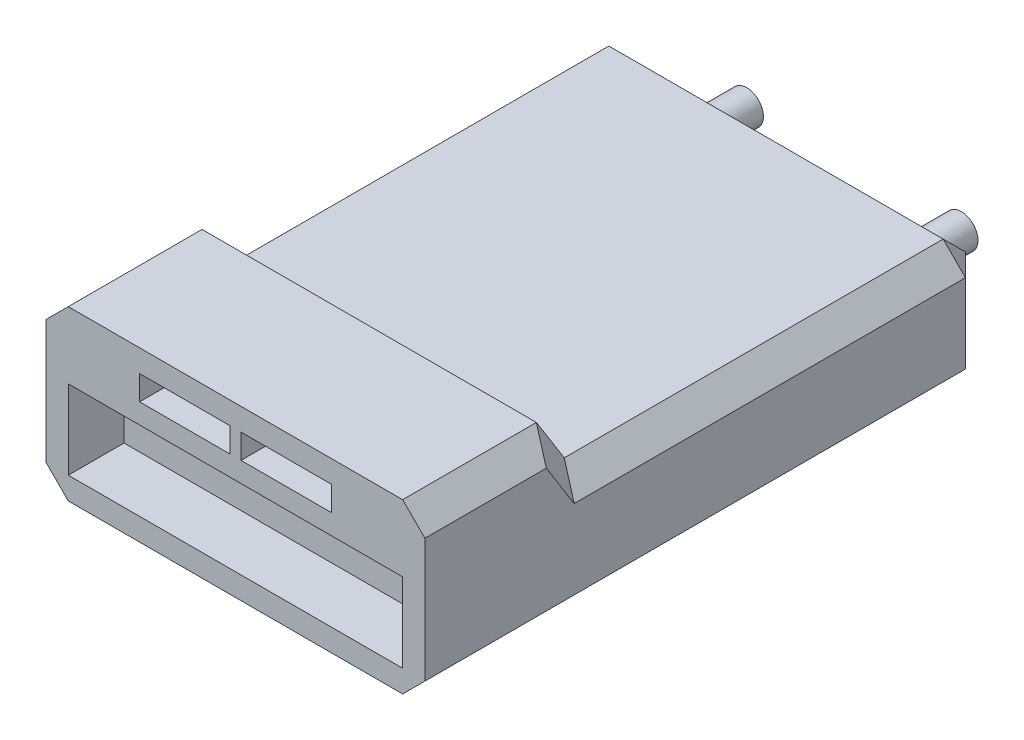
ISO-10303-21;
HEADER;
FILE_DESCRIPTION(('STEP AP214'),'2;1');
FILE_NAME('part.step','',(''),(''),'','','');
FILE_SCHEMA(('AUTOMOTIVE_DESIGN { 1 0 10303 214 1 1 1 1 }'));
ENDSEC;
DATA;
#1=APPLICATION_CONTEXT('core data for automotive mechanical design processes');
#2=APPLICATION_PROTOCOL_DEFINITION('international standard','automotive_design',2000,#1);
#3=PRODUCT_CONTEXT('',#1,'mechanical');
#4=PRODUCT('Part','Part','',(#3));
#5=PRODUCT_RELATED_PRODUCT_CATEGORY('part','',(#4));
#6=PRODUCT_DEFINITION_FORMATION('','',#4);
#7=PRODUCT_DEFINITION_CONTEXT('part definition',#1,'design');
#8=PRODUCT_DEFINITION('design','',#6,#7);
#9=PRODUCT_DEFINITION_SHAPE('','',#8);
#10=(LENGTH_UNIT() NAMED_UNIT(*) SI_UNIT(.MILLI.,.METRE.));
#11=(NAMED_UNIT(*) PLANE_ANGLE_UNIT() SI_UNIT($,.RADIAN.));
#12=(NAMED_UNIT(*) SI_UNIT($,.STERADIAN.) SOLID_ANGLE_UNIT());
#13=UNCERTAINTY_MEASURE_WITH_UNIT(LENGTH_MEASURE(1.E-05),#10,'distance_accuracy_value','');
#14=(GEOMETRIC_REPRESENTATION_CONTEXT(3) GLOBAL_UNCERTAINTY_ASSIGNED_CONTEXT((#13)) GLOBAL_UNIT_ASSIGNED_CONTEXT((#10,
#11,#12)) REPRESENTATION_CONTEXT('',''));
#15=CARTESIAN_POINT('',(0.,0.,0.));
#16=DIRECTION('',(0.,0.,1.));
#17=DIRECTION('',(1.,0.,0.));
#18=AXIS2_PLACEMENT_3D('',#15,#16,#17);
#19=CARTESIAN_POINT('',(17.,15.1,0.));
#20=DIRECTION('',(0.,0.,-1.));
#21=DIRECTION('',(0.,1.,0.));
#22=AXIS2_PLACEMENT_3D('',#19,#20,#21);
#23=PLANE('',#22);
#24=DIRECTION('',(1.,0.,0.));
#25=VECTOR('',#24,1.);
#26=CARTESIAN_POINT('',(-15.,2.,0.));
#27=LINE('',#26,#25);
#28=CARTESIAN_POINT('',(-15.,2.,0.));
#29=VERTEX_POINT('',#28);
#30=CARTESIAN_POINT('',(15.,2.,0.));
#31=VERTEX_POINT('',#30);
#32=EDGE_CURVE('E238',#29,#31,#27,.T.);
#33=ORIENTED_EDGE('',*,*,#32,.F.);
#34=DIRECTION('',(0.,-1.,0.));
#35=VECTOR('',#34,1.);
#36=CARTESIAN_POINT('',(-15.,9.1,0.));
#37=LINE('',#36,#35);
#38=CARTESIAN_POINT('',(-15.,9.1,0.));
#39=VERTEX_POINT('',#38);
#40=EDGE_CURVE('E212',#39,#29,#37,.T.);
#41=ORIENTED_EDGE('',*,*,#40,.F.);
#42=DIRECTION('',(-1.,0.,0.));
#43=VECTOR('',#42,1.);
#44=CARTESIAN_POINT('',(-15.,9.1,0.));
#45=LINE('',#44,#43);
#46=CARTESIAN_POINT('',(15.,9.1,0.));
#47=VERTEX_POINT('',#46);
#48=EDGE_CURVE('E229',#47,#39,#45,.T.);
#49=ORIENTED_EDGE('',*,*,#48,.F.);
#50=DIRECTION('',(0.,1.,0.));
#51=VECTOR('',#50,1.);
#52=CARTESIAN_POINT('',(15.,9.1,0.));
#53=LINE('',#52,#51);
#54=EDGE_CURVE('E232',#31,#47,#53,.T.);
#55=ORIENTED_EDGE('',*,*,#54,.F.);
#56=EDGE_LOOP('',(#33,#41,#49,#55));
#57=FACE_BOUND('',#56,.T.);
#58=DIRECTION('',(1.,0.,0.));
#59=VECTOR('',#58,1.);
#60=CARTESIAN_POINT('',(-8.6,10.9,0.));
#61=LINE('',#60,#59);
#62=CARTESIAN_POINT('',(-8.6,10.9,0.));
#63=VERTEX_POINT('',#62);
#64=CARTESIAN_POINT('',(-0.5,10.9,0.));
#65=VERTEX_POINT('',#64);
#66=EDGE_CURVE('E265',#63,#65,#61,.T.);
#67=ORIENTED_EDGE('',*,*,#66,.F.);
#68=DIRECTION('',(0.,-1.,0.));
#69=VECTOR('',#68,1.);
#70=CARTESIAN_POINT('',(-8.6,13.1,0.));
#71=LINE('',#70,#69);
#72=CARTESIAN_POINT('',(-8.6,13.1,0.));
#73=VERTEX_POINT('',#72);
#74=EDGE_CURVE('E263',#73,#63,#71,.T.);
#75=ORIENTED_EDGE('',*,*,#74,.F.);
#76=DIRECTION('',(-1.,0.,0.));
#77=VECTOR('',#76,1.);
#78=CARTESIAN_POINT('',(-8.6,13.1,0.));
#79=LINE('',#78,#77);
#80=CARTESIAN_POINT('',(-0.5,13.1,0.));
#81=VERTEX_POINT('',#80);
#82=EDGE_CURVE('E253',#81,#73,#79,.T.);
#83=ORIENTED_EDGE('',*,*,#82,.F.);
#84=DIRECTION('',(0.,1.,0.));
#85=VECTOR('',#84,1.);
#86=CARTESIAN_POINT('',(-0.5,13.1,0.));
#87=LINE('',#86,#85);
#88=EDGE_CURVE('E269',#65,#81,#87,.T.);
#89=ORIENTED_EDGE('',*,*,#88,.F.);
#90=EDGE_LOOP('',(#67,#75,#83,#89));
#91=FACE_BOUND('',#90,.T.);
#92=DIRECTION('',(1.,0.,0.));
#93=VECTOR('',#92,1.);
#94=CARTESIAN_POINT('',(0.499999999999999,10.9,0.));
#95=LINE('',#94,#93);
#96=CARTESIAN_POINT('',(0.5,10.9,0.));
#97=VERTEX_POINT('',#96);
#98=CARTESIAN_POINT('',(8.6,10.9,0.));
#99=VERTEX_POINT('',#98);
#100=EDGE_CURVE('E297',#97,#99,#95,.T.);
#101=ORIENTED_EDGE('',*,*,#100,.F.);
#102=DIRECTION('',(0.,-1.,0.));
#103=VECTOR('',#102,1.);
#104=CARTESIAN_POINT('',(0.499999999999999,13.1,0.));
#105=LINE('',#104,#103);
#106=CARTESIAN_POINT('',(0.499999999999999,13.1,0.));
#107=VERTEX_POINT('',#106);
#108=EDGE_CURVE('E295',#107,#97,#105,.T.);
#109=ORIENTED_EDGE('',*,*,#108,.F.);
#110=DIRECTION('',(-1.,0.,0.));
#111=VECTOR('',#110,1.);
#112=CARTESIAN_POINT('',(0.499999999999999,13.1,0.));
#113=LINE('',#112,#111);
#114=CARTESIAN_POINT('',(8.6,13.1,0.));
#115=VERTEX_POINT('',#114);
#116=EDGE_CURVE('E285',#115,#107,#113,.T.);
#117=ORIENTED_EDGE('',*,*,#116,.F.);
#118=DIRECTION('',(0.,1.,0.));
#119=VECTOR('',#118,1.);
#120=CARTESIAN_POINT('',(8.6,13.1,0.));
#121=LINE('',#120,#119);
#122=EDGE_CURVE('E300',#99,#115,#121,.T.);
#123=ORIENTED_EDGE('',*,*,#122,.F.);
#124=EDGE_LOOP('',(#101,#109,#117,#123));
#125=FACE_BOUND('',#124,.T.);
#126=DIRECTION('',(0.,-1.,0.));
#127=VECTOR('',#126,1.);
#128=CARTESIAN_POINT('',(-17.,15.1,0.));
#129=LINE('',#128,#127);
#130=CARTESIAN_POINT('',(-17.,13.1,0.));
#131=VERTEX_POINT('',#130);
#132=CARTESIAN_POINT('',(-17.,1.99999999999999,0.));
#133=VERTEX_POINT('',#132);
#134=EDGE_CURVE('E317',#131,#133,#129,.T.);
#135=ORIENTED_EDGE('',*,*,#134,.T.);
#136=DIRECTION('',(-0.707106781186546,0.707106781186549,0.));
#137=VECTOR('',#136,1.);
#138=CARTESIAN_POINT('',(-15.,0.,0.));
#139=LINE('',#138,#137);
#140=CARTESIAN_POINT('',(-15.,0.,0.));
#141=VERTEX_POINT('',#140);
#142=EDGE_CURVE('E373',#133,#141,#139,.F.);
#143=ORIENTED_EDGE('',*,*,#142,.T.);
#144=DIRECTION('',(-1.,0.,0.));
#145=VECTOR('',#144,1.);
#146=CARTESIAN_POINT('',(17.,0.,0.));
#147=LINE('',#146,#145);
#148=CARTESIAN_POINT('',(15.,0.,0.));
#149=VERTEX_POINT('',#148);
#150=EDGE_CURVE('E332',#149,#141,#147,.T.);
#151=ORIENTED_EDGE('',*,*,#150,.F.);
#152=DIRECTION('',(0.707106781186549,0.707106781186546,0.));
#153=VECTOR('',#152,1.);
#154=CARTESIAN_POINT('',(17.,1.99999999999999,0.));
#155=LINE('',#154,#153);
#156=CARTESIAN_POINT('',(17.,1.99999999999999,0.));
#157=VERTEX_POINT('',#156);
#158=EDGE_CURVE('E371',#149,#157,#155,.T.);
#159=ORIENTED_EDGE('',*,*,#158,.T.);
#160=DIRECTION('',(0.,-1.,0.));
#161=VECTOR('',#160,1.);
#162=CARTESIAN_POINT('',(17.,15.1,0.));
#163=LINE('',#162,#161);
#164=CARTESIAN_POINT('',(17.,13.1,0.));
#165=VERTEX_POINT('',#164);
#166=EDGE_CURVE('E318',#165,#157,#163,.T.);
#167=ORIENTED_EDGE('',*,*,#166,.F.);
#168=DIRECTION('',(-0.707106781186549,0.707106781186547,0.));
#169=VECTOR('',#168,1.);
#170=CARTESIAN_POINT('',(17.,13.1,0.));
#171=LINE('',#170,#169);
#172=CARTESIAN_POINT('',(15.,15.1,0.));
#173=VERTEX_POINT('',#172);
#174=EDGE_CURVE('E367',#165,#173,#171,.T.);
#175=ORIENTED_EDGE('',*,*,#174,.T.);
#176=DIRECTION('',(-1.,0.,0.));
#177=VECTOR('',#176,1.);
#178=CARTESIAN_POINT('',(17.,15.1,0.));
#179=LINE('',#178,#177);
#180=CARTESIAN_POINT('',(-15.,15.1,0.));
#181=VERTEX_POINT('',#180);
#182=EDGE_CURVE('E321',#173,#181,#179,.T.);
#183=ORIENTED_EDGE('',*,*,#182,.T.);
#184=DIRECTION('',(0.707106781186546,0.707106781186549,0.));
#185=VECTOR('',#184,1.);
#186=CARTESIAN_POINT('',(-15.,15.1,0.));
#187=LINE('',#186,#185);
#188=EDGE_CURVE('E369',#181,#131,#187,.F.);
#189=ORIENTED_EDGE('',*,*,#188,.T.);
#190=EDGE_LOOP('',(#135,#143,#151,#159,#167,#175,#183,#189));
#191=FACE_BOUND('',#190,.T.);
#192=ADVANCED_FACE('F32',(#57,#91,#125,#191),#23,.F.);
#193=CARTESIAN_POINT('',(17.,0.,0.));
#194=DIRECTION('',(0.,1.,0.));
#195=DIRECTION('',(0.,0.,1.));
#196=AXIS2_PLACEMENT_3D('',#193,#194,#195);
#197=PLANE('',#196);
#198=ORIENTED_EDGE('',*,*,#150,.T.);
#199=DIRECTION('',(0.,0.,-1.));
#200=VECTOR('',#199,1.);
#201=CARTESIAN_POINT('',(-15.,0.,0.));
#202=LINE('',#201,#200);
#203=CARTESIAN_POINT('',(-15.,0.,-48.5));
#204=VERTEX_POINT('',#203);
#205=EDGE_CURVE('E365',#141,#204,#202,.T.);
#206=ORIENTED_EDGE('',*,*,#205,.T.);
#207=DIRECTION('',(1.,0.,0.));
#208=VECTOR('',#207,1.);
#209=CARTESIAN_POINT('',(17.,0.,-48.5));
#210=LINE('',#209,#208);
#211=CARTESIAN_POINT('',(15.,0.,-48.5));
#212=VERTEX_POINT('',#211);
#213=EDGE_CURVE('E363',#204,#212,#210,.T.);
#214=ORIENTED_EDGE('',*,*,#213,.T.);
#215=DIRECTION('',(0.,0.,1.));
#216=VECTOR('',#215,1.);
#217=CARTESIAN_POINT('',(15.,0.,0.));
#218=LINE('',#217,#216);
#219=EDGE_CURVE('E361',#212,#149,#218,.T.);
#220=ORIENTED_EDGE('',*,*,#219,.T.);
#221=EDGE_LOOP('',(#198,#206,#214,#220));
#222=FACE_BOUND('',#221,.T.);
#223=ADVANCED_FACE('F484',(#222),#197,.F.);
#224=CARTESIAN_POINT('',(17.,0.,-50.5));
#225=DIRECTION('',(0.,0.,1.));
#226=DIRECTION('',(1.,0.,0.));
#227=AXIS2_PLACEMENT_3D('',#224,#225,#226);
#228=PLANE('',#227);
#229=DIRECTION('',(-1.,0.,0.));
#230=VECTOR('',#229,1.);
#231=CARTESIAN_POINT('',(17.,1.99999999999999,-50.5));
#232=LINE('',#231,#230);
#233=CARTESIAN_POINT('',(15.,1.99999999999999,-50.5));
#234=VERTEX_POINT('',#233);
#235=CARTESIAN_POINT('',(-15.,1.99999999999999,-50.5));
#236=VERTEX_POINT('',#235);
#237=EDGE_CURVE('E345',#234,#236,#232,.T.);
#238=ORIENTED_EDGE('',*,*,#237,.T.);
#239=DIRECTION('',(0.,1.,0.));
#240=VECTOR('',#239,1.);
#241=CARTESIAN_POINT('',(-15.,0.,-50.5));
#242=LINE('',#241,#240);
#243=CARTESIAN_POINT('',(-15.,9.10000000000001,-50.5));
#244=VERTEX_POINT('',#243);
#245=EDGE_CURVE('E347',#236,#244,#242,.T.);
#246=ORIENTED_EDGE('',*,*,#245,.T.);
#247=DIRECTION('',(1.,0.,0.));
#248=VECTOR('',#247,1.);
#249=CARTESIAN_POINT('',(17.,9.10000000000001,-50.5));
#250=LINE('',#249,#248);
#251=CARTESIAN_POINT('',(15.,9.10000000000001,-50.5));
#252=VERTEX_POINT('',#251);
#253=EDGE_CURVE('E341',#244,#252,#250,.T.);
#254=ORIENTED_EDGE('',*,*,#253,.T.);
#255=DIRECTION('',(0.,-1.,0.));
#256=VECTOR('',#255,1.);
#257=CARTESIAN_POINT('',(15.,0.,-50.5));
#258=LINE('',#257,#256);
#259=EDGE_CURVE('E343',#252,#234,#258,.T.);
#260=ORIENTED_EDGE('',*,*,#259,.T.);
#261=EDGE_LOOP('',(#238,#246,#254,#260));
#262=FACE_BOUND('',#261,.T.);
#263=CARTESIAN_POINT('',(9.625,5.55,-50.5));
#264=DIRECTION('',(0.,0.,1.));
#265=DIRECTION('',(1.,0.,0.));
#266=AXIS2_PLACEMENT_3D('',#263,#264,#265);
#267=CIRCLE('',#266,1.5);
#268=CARTESIAN_POINT('',(11.125,5.55,-50.5));
#269=VERTEX_POINT('',#268);
#270=EDGE_CURVE('E338',#269,#269,#267,.F.);
#271=ORIENTED_EDGE('',*,*,#270,.F.);
#272=EDGE_LOOP('',(#271));
#273=FACE_BOUND('',#272,.T.);
#274=CARTESIAN_POINT('',(-9.625,5.55,-50.5));
#275=DIRECTION('',(0.,0.,1.));
#276=DIRECTION('',(1.,0.,0.));
#277=AXIS2_PLACEMENT_3D('',#274,#275,#276);
#278=CIRCLE('',#277,1.5);
#279=CARTESIAN_POINT('',(-8.125,5.55,-50.5));
#280=VERTEX_POINT('',#279);
#281=EDGE_CURVE('E335',#280,#280,#278,.F.);
#282=ORIENTED_EDGE('',*,*,#281,.F.);
#283=EDGE_LOOP('',(#282));
#284=FACE_BOUND('',#283,.T.);
#285=ADVANCED_FACE('F490',(#262,#273,#284),#228,.F.);
#286=CARTESIAN_POINT('',(17.,11.1,-50.5));
#287=DIRECTION('',(0.,-1.,0.));
#288=DIRECTION('',(0.,0.,-1.));
#289=AXIS2_PLACEMENT_3D('',#286,#287,#288);
#290=PLANE('',#289);
#291=DIRECTION('',(-1.,0.,0.));
#292=VECTOR('',#291,1.);
#293=CARTESIAN_POINT('',(17.,11.1,-48.5));
#294=LINE('',#293,#292);
#295=CARTESIAN_POINT('',(15.,11.1,-48.5));
#296=VERTEX_POINT('',#295);
#297=CARTESIAN_POINT('',(-15.,11.1,-48.5));
#298=VERTEX_POINT('',#297);
#299=EDGE_CURVE('E41',#296,#298,#294,.T.);
#300=ORIENTED_EDGE('',*,*,#299,.T.);
#301=DIRECTION('',(0.,0.,1.));
#302=VECTOR('',#301,1.);
#303=CARTESIAN_POINT('',(-15.,11.1,-50.5));
#304=LINE('',#303,#302);
#305=CARTESIAN_POINT('',(-15.,11.1,-14.5));
#306=VERTEX_POINT('',#305);
#307=EDGE_CURVE('E11',#298,#306,#304,.T.);
#308=ORIENTED_EDGE('',*,*,#307,.T.);
#309=DIRECTION('',(-1.,0.,0.));
#310=VECTOR('',#309,1.);
#311=CARTESIAN_POINT('',(17.,11.1,-14.5));
#312=LINE('',#311,#310);
#313=CARTESIAN_POINT('',(15.,11.1,-14.5));
#314=VERTEX_POINT('',#313);
#315=EDGE_CURVE('E329',#314,#306,#312,.T.);
#316=ORIENTED_EDGE('',*,*,#315,.F.);
#317=DIRECTION('',(0.,0.,-1.));
#318=VECTOR('',#317,1.);
#319=CARTESIAN_POINT('',(15.,11.1,-50.5));
#320=LINE('',#319,#318);
#321=EDGE_CURVE('E52',#314,#296,#320,.T.);
#322=ORIENTED_EDGE('',*,*,#321,.T.);
#323=EDGE_LOOP('',(#300,#308,#316,#322));
#324=FACE_BOUND('',#323,.T.);
#325=ADVANCED_FACE('F573',(#324),#290,.F.);
#326=CARTESIAN_POINT('',(17.,11.1,-14.5));
#327=DIRECTION('',(0.,-0.52999894000318,0.847998304005088));
#328=DIRECTION('',(0.,-0.847998304005088,-0.52999894000318));
#329=AXIS2_PLACEMENT_3D('',#326,#327,#328);
#330=PLANE('',#329);
#331=ORIENTED_EDGE('',*,*,#315,.T.);
#332=DIRECTION('',(0.,0.847998304005088,0.52999894000318));
#333=VECTOR('',#332,1.);
#334=CARTESIAN_POINT('',(-15.,11.1,-14.5));
#335=LINE('',#334,#333);
#336=CARTESIAN_POINT('',(-15.,15.1,-12.));
#337=VERTEX_POINT('',#336);
#338=EDGE_CURVE('E391',#306,#337,#335,.T.);
#339=ORIENTED_EDGE('',*,*,#338,.T.);
#340=DIRECTION('',(-1.,0.,0.));
#341=VECTOR('',#340,1.);
#342=CARTESIAN_POINT('',(17.,15.1,-12.));
#343=LINE('',#342,#341);
#344=CARTESIAN_POINT('',(15.,15.1,-12.));
#345=VERTEX_POINT('',#344);
#346=EDGE_CURVE('E326',#345,#337,#343,.T.);
#347=ORIENTED_EDGE('',*,*,#346,.F.);
#348=DIRECTION('',(0.,-0.847998304005088,-0.52999894000318));
#349=VECTOR('',#348,1.);
#350=CARTESIAN_POINT('',(15.,11.1,-14.5));
#351=LINE('',#350,#349);
#352=EDGE_CURVE('E389',#345,#314,#351,.T.);
#353=ORIENTED_EDGE('',*,*,#352,.T.);
#354=EDGE_LOOP('',(#331,#339,#347,#353));
#355=FACE_BOUND('',#354,.T.);
#356=ADVANCED_FACE('F558',(#355),#330,.F.);
#357=CARTESIAN_POINT('',(17.,15.1,-12.));
#358=DIRECTION('',(0.,-1.,0.));
#359=DIRECTION('',(0.,0.,-1.));
#360=AXIS2_PLACEMENT_3D('',#357,#358,#359);
#361=PLANE('',#360);
#362=ORIENTED_EDGE('',*,*,#346,.T.);
#363=DIRECTION('',(0.,0.,1.));
#364=VECTOR('',#363,1.);
#365=CARTESIAN_POINT('',(-15.,15.1,-12.));
#366=LINE('',#365,#364);
#367=EDGE_CURVE('E387',#337,#181,#366,.T.);
#368=ORIENTED_EDGE('',*,*,#367,.T.);
#369=ORIENTED_EDGE('',*,*,#182,.F.);
#370=DIRECTION('',(0.,0.,-1.));
#371=VECTOR('',#370,1.);
#372=CARTESIAN_POINT('',(15.,15.1,-12.));
#373=LINE('',#372,#371);
#374=EDGE_CURVE('E385',#173,#345,#373,.T.);
#375=ORIENTED_EDGE('',*,*,#374,.T.);
#376=EDGE_LOOP('',(#362,#368,#369,#375));
#377=FACE_BOUND('',#376,.T.);
#378=ADVANCED_FACE('F561',(#377),#361,.F.);
#379=CARTESIAN_POINT('',(17.,0.,0.));
#380=DIRECTION('',(1.,0.,0.));
#381=DIRECTION('',(0.,0.,-1.));
#382=AXIS2_PLACEMENT_3D('',#379,#380,#381);
#383=PLANE('',#382);
#384=ORIENTED_EDGE('',*,*,#166,.T.);
#385=DIRECTION('',(0.,0.,-1.));
#386=VECTOR('',#385,1.);
#387=CARTESIAN_POINT('',(17.,1.99999999999999,-50.5));
#388=LINE('',#387,#386);
#389=CARTESIAN_POINT('',(17.,1.99999999999999,-48.5));
#390=VERTEX_POINT('',#389);
#391=EDGE_CURVE('E383',#157,#390,#388,.T.);
#392=ORIENTED_EDGE('',*,*,#391,.T.);
#393=DIRECTION('',(0.,1.,0.));
#394=VECTOR('',#393,1.);
#395=CARTESIAN_POINT('',(17.,11.1,-48.5));
#396=LINE('',#395,#394);
#397=CARTESIAN_POINT('',(17.,9.10000000000001,-48.5));
#398=VERTEX_POINT('',#397);
#399=EDGE_CURVE('E381',#390,#398,#396,.T.);
#400=ORIENTED_EDGE('',*,*,#399,.T.);
#401=DIRECTION('',(0.,0.,1.));
#402=VECTOR('',#401,1.);
#403=CARTESIAN_POINT('',(17.,9.10000000000001,-14.5));
#404=LINE('',#403,#402);
#405=CARTESIAN_POINT('',(17.,9.10000000000001,-13.3915047169859));
#406=VERTEX_POINT('',#405);
#407=EDGE_CURVE('E375',#398,#406,#404,.T.);
#408=ORIENTED_EDGE('',*,*,#407,.T.);
#409=DIRECTION('',(0.,0.847998304005088,0.52999894000318));
#410=VECTOR('',#409,1.);
#411=CARTESIAN_POINT('',(17.,14.0400021199936,-10.3040033919898));
#412=LINE('',#411,#410);
#413=CARTESIAN_POINT('',(17.,13.1,-10.8915047169859));
#414=VERTEX_POINT('',#413);
#415=EDGE_CURVE('E377',#406,#414,#412,.T.);
#416=ORIENTED_EDGE('',*,*,#415,.T.);
#417=DIRECTION('',(0.,0.,1.));
#418=VECTOR('',#417,1.);
#419=CARTESIAN_POINT('',(17.,13.1,0.));
#420=LINE('',#419,#418);
#421=EDGE_CURVE('E379',#414,#165,#420,.T.);
#422=ORIENTED_EDGE('',*,*,#421,.T.);
#423=EDGE_LOOP('',(#384,#392,#400,#408,#416,#422));
#424=FACE_BOUND('',#423,.T.);
#425=ADVANCED_FACE('F451',(#424),#383,.T.);
#426=CARTESIAN_POINT('',(-17.,0.,0.));
#427=DIRECTION('',(1.,0.,0.));
#428=DIRECTION('',(0.,0.,-1.));
#429=AXIS2_PLACEMENT_3D('',#426,#427,#428);
#430=PLANE('',#429);
#431=DIRECTION('',(0.,-1.,0.));
#432=VECTOR('',#431,1.);
#433=CARTESIAN_POINT('',(-17.,0.,-48.5));
#434=LINE('',#433,#432);
#435=CARTESIAN_POINT('',(-17.,9.10000000000001,-48.5));
#436=VERTEX_POINT('',#435);
#437=CARTESIAN_POINT('',(-17.,1.99999999999999,-48.5));
#438=VERTEX_POINT('',#437);
#439=EDGE_CURVE('E356',#436,#438,#434,.T.);
#440=ORIENTED_EDGE('',*,*,#439,.T.);
#441=DIRECTION('',(0.,0.,1.));
#442=VECTOR('',#441,1.);
#443=CARTESIAN_POINT('',(-17.,1.99999999999999,0.));
#444=LINE('',#443,#442);
#445=EDGE_CURVE('E359',#438,#133,#444,.T.);
#446=ORIENTED_EDGE('',*,*,#445,.T.);
#447=ORIENTED_EDGE('',*,*,#134,.F.);
#448=DIRECTION('',(0.,0.,-1.));
#449=VECTOR('',#448,1.);
#450=CARTESIAN_POINT('',(-17.,13.1,0.));
#451=LINE('',#450,#449);
#452=CARTESIAN_POINT('',(-17.,13.1,-10.8915047169859));
#453=VERTEX_POINT('',#452);
#454=EDGE_CURVE('E354',#131,#453,#451,.T.);
#455=ORIENTED_EDGE('',*,*,#454,.T.);
#456=DIRECTION('',(0.,-0.847998304005088,-0.52999894000318));
#457=VECTOR('',#456,1.);
#458=CARTESIAN_POINT('',(-17.,8.57483358066781,-13.7197337290685));
#459=LINE('',#458,#457);
#460=CARTESIAN_POINT('',(-17.,9.10000000000001,-13.3915047169859));
#461=VERTEX_POINT('',#460);
#462=EDGE_CURVE('E352',#453,#461,#459,.T.);
#463=ORIENTED_EDGE('',*,*,#462,.T.);
#464=DIRECTION('',(0.,0.,-1.));
#465=VECTOR('',#464,1.);
#466=CARTESIAN_POINT('',(-17.,9.10000000000001,0.));
#467=LINE('',#466,#465);
#468=EDGE_CURVE('E350',#461,#436,#467,.T.);
#469=ORIENTED_EDGE('',*,*,#468,.T.);
#470=EDGE_LOOP('',(#440,#446,#447,#455,#463,#469));
#471=FACE_BOUND('',#470,.T.);
#472=ADVANCED_FACE('F548',(#471),#430,.F.);
#473=CARTESIAN_POINT('',(-9.625,5.55,-55.5));
#474=DIRECTION('',(0.,0.,1.));
#475=DIRECTION('',(1.,0.,0.));
#476=AXIS2_PLACEMENT_3D('',#473,#474,#475);
#477=CYLINDRICAL_SURFACE('',#476,1.5);
#478=CARTESIAN_POINT('',(-9.625,5.55,-55.5));
#479=DIRECTION('',(0.,0.,-1.));
#480=DIRECTION('',(-1.,0.,0.));
#481=AXIS2_PLACEMENT_3D('',#478,#479,#480);
#482=CIRCLE('',#481,1.5);
#483=CARTESIAN_POINT('',(-11.125,5.55,-55.5));
#484=VERTEX_POINT('',#483);
#485=EDGE_CURVE('E314',#484,#484,#482,.T.);
#486=ORIENTED_EDGE('',*,*,#485,.F.);
#487=EDGE_LOOP('',(#486));
#488=FACE_BOUND('',#487,.T.);
#489=ORIENTED_EDGE('',*,*,#281,.T.);
#490=EDGE_LOOP('',(#489));
#491=FACE_BOUND('',#490,.T.);
#492=ADVANCED_FACE('F610',(#488,#491),#477,.T.);
#493=CARTESIAN_POINT('',(-9.625,5.55,-55.5));
#494=DIRECTION('',(0.,0.,-1.));
#495=DIRECTION('',(-1.,0.,0.));
#496=AXIS2_PLACEMENT_3D('',#493,#494,#495);
#497=PLANE('',#496);
#498=ORIENTED_EDGE('',*,*,#485,.T.);
#499=EDGE_LOOP('',(#498));
#500=FACE_BOUND('',#499,.T.);
#501=ADVANCED_FACE('F838',(#500),#497,.T.);
#502=CARTESIAN_POINT('',(9.625,5.55,-55.5));
#503=DIRECTION('',(0.,0.,1.));
#504=DIRECTION('',(1.,0.,0.));
#505=AXIS2_PLACEMENT_3D('',#502,#503,#504);
#506=CYLINDRICAL_SURFACE('',#505,1.5);
#507=CARTESIAN_POINT('',(9.625,5.55,-55.5));
#508=DIRECTION('',(0.,0.,-1.));
#509=DIRECTION('',(-1.,0.,0.));
#510=AXIS2_PLACEMENT_3D('',#507,#508,#509);
#511=CIRCLE('',#510,1.5);
#512=CARTESIAN_POINT('',(8.125,5.55,-55.5));
#513=VERTEX_POINT('',#512);
#514=EDGE_CURVE('E245',#513,#513,#511,.T.);
#515=ORIENTED_EDGE('',*,*,#514,.F.);
#516=EDGE_LOOP('',(#515));
#517=FACE_BOUND('',#516,.T.);
#518=ORIENTED_EDGE('',*,*,#270,.T.);
#519=EDGE_LOOP('',(#518));
#520=FACE_BOUND('',#519,.T.);
#521=ADVANCED_FACE('F830',(#517,#520),#506,.T.);
#522=CARTESIAN_POINT('',(9.625,5.55,-55.5));
#523=DIRECTION('',(0.,0.,-1.));
#524=DIRECTION('',(-1.,0.,0.));
#525=AXIS2_PLACEMENT_3D('',#522,#523,#524);
#526=PLANE('',#525);
#527=ORIENTED_EDGE('',*,*,#514,.T.);
#528=EDGE_LOOP('',(#527));
#529=FACE_BOUND('',#528,.T.);
#530=ADVANCED_FACE('F822',(#529),#526,.T.);
#531=CARTESIAN_POINT('',(0.499999999999999,13.1,-5.));
#532=DIRECTION('',(-1.,0.,0.));
#533=DIRECTION('',(0.,0.,1.));
#534=AXIS2_PLACEMENT_3D('',#531,#532,#533);
#535=PLANE('',#534);
#536=ORIENTED_EDGE('',*,*,#108,.T.);
#537=DIRECTION('',(0.,0.,1.));
#538=VECTOR('',#537,1.);
#539=CARTESIAN_POINT('',(0.499999999999999,10.9,-5.));
#540=LINE('',#539,#538);
#541=CARTESIAN_POINT('',(0.499999999999999,10.9,-5.));
#542=VERTEX_POINT('',#541);
#543=EDGE_CURVE('E294',#542,#97,#540,.T.);
#544=ORIENTED_EDGE('',*,*,#543,.F.);
#545=DIRECTION('',(0.,-1.,0.));
#546=VECTOR('',#545,1.);
#547=CARTESIAN_POINT('',(0.499999999999999,13.1,-5.));
#548=LINE('',#547,#546);
#549=CARTESIAN_POINT('',(0.499999999999999,13.1,-5.));
#550=VERTEX_POINT('',#549);
#551=EDGE_CURVE('E281',#550,#542,#548,.T.);
#552=ORIENTED_EDGE('',*,*,#551,.F.);
#553=DIRECTION('',(0.,0.,1.));
#554=VECTOR('',#553,1.);
#555=CARTESIAN_POINT('',(0.499999999999999,13.1,-5.));
#556=LINE('',#555,#554);
#557=EDGE_CURVE('E266',#550,#107,#556,.T.);
#558=ORIENTED_EDGE('',*,*,#557,.T.);
#559=EDGE_LOOP('',(#536,#544,#552,#558));
#560=FACE_BOUND('',#559,.T.);
#561=ADVANCED_FACE('F814',(#560),#535,.F.);
#562=CARTESIAN_POINT('',(0.499999999999999,13.1,-5.));
#563=DIRECTION('',(0.,1.,0.));
#564=DIRECTION('',(0.,0.,1.));
#565=AXIS2_PLACEMENT_3D('',#562,#563,#564);
#566=PLANE('',#565);
#567=ORIENTED_EDGE('',*,*,#116,.T.);
#568=ORIENTED_EDGE('',*,*,#557,.F.);
#569=DIRECTION('',(-1.,0.,0.));
#570=VECTOR('',#569,1.);
#571=CARTESIAN_POINT('',(0.499999999999999,13.1,-5.));
#572=LINE('',#571,#570);
#573=CARTESIAN_POINT('',(8.6,13.1,-5.));
#574=VERTEX_POINT('',#573);
#575=EDGE_CURVE('E291',#574,#550,#572,.T.);
#576=ORIENTED_EDGE('',*,*,#575,.F.);
#577=DIRECTION('',(0.,0.,1.));
#578=VECTOR('',#577,1.);
#579=CARTESIAN_POINT('',(8.6,13.1,-5.));
#580=LINE('',#579,#578);
#581=EDGE_CURVE('E306',#574,#115,#580,.T.);
#582=ORIENTED_EDGE('',*,*,#581,.T.);
#583=EDGE_LOOP('',(#567,#568,#576,#582));
#584=FACE_BOUND('',#583,.T.);
#585=ADVANCED_FACE('F806',(#584),#566,.F.);
#586=CARTESIAN_POINT('',(8.6,13.1,-5.));
#587=DIRECTION('',(1.,0.,0.));
#588=DIRECTION('',(0.,0.,-1.));
#589=AXIS2_PLACEMENT_3D('',#586,#587,#588);
#590=PLANE('',#589);
#591=ORIENTED_EDGE('',*,*,#122,.T.);
#592=ORIENTED_EDGE('',*,*,#581,.F.);
#593=DIRECTION('',(0.,1.,0.));
#594=VECTOR('',#593,1.);
#595=CARTESIAN_POINT('',(8.6,13.1,-5.));
#596=LINE('',#595,#594);
#597=CARTESIAN_POINT('',(8.6,10.9,-5.));
#598=VERTEX_POINT('',#597);
#599=EDGE_CURVE('E288',#598,#574,#596,.T.);
#600=ORIENTED_EDGE('',*,*,#599,.F.);
#601=DIRECTION('',(0.,0.,1.));
#602=VECTOR('',#601,1.);
#603=CARTESIAN_POINT('',(8.6,10.9,-5.));
#604=LINE('',#603,#602);
#605=EDGE_CURVE('E308',#598,#99,#604,.T.);
#606=ORIENTED_EDGE('',*,*,#605,.T.);
#607=EDGE_LOOP('',(#591,#592,#600,#606));
#608=FACE_BOUND('',#607,.T.);
#609=ADVANCED_FACE('F798',(#608),#590,.F.);
#610=CARTESIAN_POINT('',(0.499999999999999,10.9,-5.));
#611=DIRECTION('',(0.,-1.,0.));
#612=DIRECTION('',(0.,0.,-1.));
#613=AXIS2_PLACEMENT_3D('',#610,#611,#612);
#614=PLANE('',#613);
#615=ORIENTED_EDGE('',*,*,#100,.T.);
#616=ORIENTED_EDGE('',*,*,#605,.F.);
#617=DIRECTION('',(1.,0.,0.));
#618=VECTOR('',#617,1.);
#619=CARTESIAN_POINT('',(0.499999999999999,10.9,-5.));
#620=LINE('',#619,#618);
#621=EDGE_CURVE('E284',#542,#598,#620,.T.);
#622=ORIENTED_EDGE('',*,*,#621,.F.);
#623=ORIENTED_EDGE('',*,*,#543,.T.);
#624=EDGE_LOOP('',(#615,#616,#622,#623));
#625=FACE_BOUND('',#624,.T.);
#626=ADVANCED_FACE('F790',(#625),#614,.F.);
#627=CARTESIAN_POINT('',(0.,0.,-5.));
#628=DIRECTION('',(0.,0.,1.));
#629=DIRECTION('',(1.,0.,0.));
#630=AXIS2_PLACEMENT_3D('',#627,#628,#629);
#631=PLANE('',#630);
#632=ORIENTED_EDGE('',*,*,#551,.T.);
#633=ORIENTED_EDGE('',*,*,#621,.T.);
#634=ORIENTED_EDGE('',*,*,#599,.T.);
#635=ORIENTED_EDGE('',*,*,#575,.T.);
#636=EDGE_LOOP('',(#632,#633,#634,#635));
#637=FACE_BOUND('',#636,.T.);
#638=ADVANCED_FACE('F782',(#637),#631,.T.);
#639=CARTESIAN_POINT('',(-8.6,13.1,-5.));
#640=DIRECTION('',(-1.,0.,0.));
#641=DIRECTION('',(0.,0.,1.));
#642=AXIS2_PLACEMENT_3D('',#639,#640,#641);
#643=PLANE('',#642);
#644=ORIENTED_EDGE('',*,*,#74,.T.);
#645=DIRECTION('',(0.,0.,1.));
#646=VECTOR('',#645,1.);
#647=CARTESIAN_POINT('',(-8.6,10.9,-5.));
#648=LINE('',#647,#646);
#649=CARTESIAN_POINT('',(-8.6,10.9,-5.));
#650=VERTEX_POINT('',#649);
#651=EDGE_CURVE('E262',#650,#63,#648,.T.);
#652=ORIENTED_EDGE('',*,*,#651,.F.);
#653=DIRECTION('',(0.,-1.,0.));
#654=VECTOR('',#653,1.);
#655=CARTESIAN_POINT('',(-8.6,13.1,-5.));
#656=LINE('',#655,#654);
#657=CARTESIAN_POINT('',(-8.6,13.1,-5.));
#658=VERTEX_POINT('',#657);
#659=EDGE_CURVE('E249',#658,#650,#656,.T.);
#660=ORIENTED_EDGE('',*,*,#659,.F.);
#661=DIRECTION('',(0.,0.,1.));
#662=VECTOR('',#661,1.);
#663=CARTESIAN_POINT('',(-8.6,13.1,-5.));
#664=LINE('',#663,#662);
#665=EDGE_CURVE('E239',#658,#73,#664,.T.);
#666=ORIENTED_EDGE('',*,*,#665,.T.);
#667=EDGE_LOOP('',(#644,#652,#660,#666));
#668=FACE_BOUND('',#667,.T.);
#669=ADVANCED_FACE('F774',(#668),#643,.F.);
#670=CARTESIAN_POINT('',(-8.6,13.1,-5.));
#671=DIRECTION('',(0.,1.,0.));
#672=DIRECTION('',(0.,0.,1.));
#673=AXIS2_PLACEMENT_3D('',#670,#671,#672);
#674=PLANE('',#673);
#675=ORIENTED_EDGE('',*,*,#82,.T.);
#676=ORIENTED_EDGE('',*,*,#665,.F.);
#677=DIRECTION('',(-1.,0.,0.));
#678=VECTOR('',#677,1.);
#679=CARTESIAN_POINT('',(-8.6,13.1,-5.));
#680=LINE('',#679,#678);
#681=CARTESIAN_POINT('',(-0.5,13.1,-5.));
#682=VERTEX_POINT('',#681);
#683=EDGE_CURVE('E259',#682,#658,#680,.T.);
#684=ORIENTED_EDGE('',*,*,#683,.F.);
#685=DIRECTION('',(0.,0.,1.));
#686=VECTOR('',#685,1.);
#687=CARTESIAN_POINT('',(-0.5,13.1,-5.));
#688=LINE('',#687,#686);
#689=EDGE_CURVE('E275',#682,#81,#688,.T.);
#690=ORIENTED_EDGE('',*,*,#689,.T.);
#691=EDGE_LOOP('',(#675,#676,#684,#690));
#692=FACE_BOUND('',#691,.T.);
#693=ADVANCED_FACE('F766',(#692),#674,.F.);
#694=CARTESIAN_POINT('',(-0.5,13.1,-5.));
#695=DIRECTION('',(1.,0.,0.));
#696=DIRECTION('',(0.,0.,-1.));
#697=AXIS2_PLACEMENT_3D('',#694,#695,#696);
#698=PLANE('',#697);
#699=ORIENTED_EDGE('',*,*,#88,.T.);
#700=ORIENTED_EDGE('',*,*,#689,.F.);
#701=DIRECTION('',(0.,1.,0.));
#702=VECTOR('',#701,1.);
#703=CARTESIAN_POINT('',(-0.5,13.1,-5.));
#704=LINE('',#703,#702);
#705=CARTESIAN_POINT('',(-0.5,10.9,-5.));
#706=VERTEX_POINT('',#705);
#707=EDGE_CURVE('E256',#706,#682,#704,.T.);
#708=ORIENTED_EDGE('',*,*,#707,.F.);
#709=DIRECTION('',(0.,0.,1.));
#710=VECTOR('',#709,1.);
#711=CARTESIAN_POINT('',(-0.5,10.9,-5.));
#712=LINE('',#711,#710);
#713=EDGE_CURVE('E277',#706,#65,#712,.T.);
#714=ORIENTED_EDGE('',*,*,#713,.T.);
#715=EDGE_LOOP('',(#699,#700,#708,#714));
#716=FACE_BOUND('',#715,.T.);
#717=ADVANCED_FACE('F758',(#716),#698,.F.);
#718=CARTESIAN_POINT('',(-8.6,10.9,-5.));
#719=DIRECTION('',(0.,-1.,0.));
#720=DIRECTION('',(0.,0.,-1.));
#721=AXIS2_PLACEMENT_3D('',#718,#719,#720);
#722=PLANE('',#721);
#723=ORIENTED_EDGE('',*,*,#66,.T.);
#724=ORIENTED_EDGE('',*,*,#713,.F.);
#725=DIRECTION('',(1.,0.,0.));
#726=VECTOR('',#725,1.);
#727=CARTESIAN_POINT('',(-8.6,10.9,-5.));
#728=LINE('',#727,#726);
#729=EDGE_CURVE('E252',#650,#706,#728,.T.);
#730=ORIENTED_EDGE('',*,*,#729,.F.);
#731=ORIENTED_EDGE('',*,*,#651,.T.);
#732=EDGE_LOOP('',(#723,#724,#730,#731));
#733=FACE_BOUND('',#732,.T.);
#734=ADVANCED_FACE('F750',(#733),#722,.F.);
#735=CARTESIAN_POINT('',(0.,0.,-5.));
#736=DIRECTION('',(0.,0.,1.));
#737=DIRECTION('',(1.,0.,0.));
#738=AXIS2_PLACEMENT_3D('',#735,#736,#737);
#739=PLANE('',#738);
#740=ORIENTED_EDGE('',*,*,#659,.T.);
#741=ORIENTED_EDGE('',*,*,#729,.T.);
#742=ORIENTED_EDGE('',*,*,#707,.T.);
#743=ORIENTED_EDGE('',*,*,#683,.T.);
#744=EDGE_LOOP('',(#740,#741,#742,#743));
#745=FACE_BOUND('',#744,.T.);
#746=ADVANCED_FACE('F743',(#745),#739,.T.);
#747=CARTESIAN_POINT('',(-15.,9.1,-5.));
#748=DIRECTION('',(-1.,0.,0.));
#749=DIRECTION('',(0.,-1.,0.));
#750=AXIS2_PLACEMENT_3D('',#747,#748,#749);
#751=PLANE('',#750);
#752=ORIENTED_EDGE('',*,*,#40,.T.);
#753=DIRECTION('',(0.,0.,1.));
#754=VECTOR('',#753,1.);
#755=CARTESIAN_POINT('',(-15.,2.,-5.));
#756=LINE('',#755,#754);
#757=CARTESIAN_POINT('',(-15.,2.,-5.));
#758=VERTEX_POINT('',#757);
#759=EDGE_CURVE('E205',#758,#29,#756,.T.);
#760=ORIENTED_EDGE('',*,*,#759,.F.);
#761=DIRECTION('',(0.,-1.,0.));
#762=VECTOR('',#761,1.);
#763=CARTESIAN_POINT('',(-15.,9.1,-5.));
#764=LINE('',#763,#762);
#765=CARTESIAN_POINT('',(-15.,9.1,-5.));
#766=VERTEX_POINT('',#765);
#767=EDGE_CURVE('E209',#766,#758,#764,.T.);
#768=ORIENTED_EDGE('',*,*,#767,.F.);
#769=DIRECTION('',(0.,0.,1.));
#770=VECTOR('',#769,1.);
#771=CARTESIAN_POINT('',(-15.,9.1,-5.));
#772=LINE('',#771,#770);
#773=EDGE_CURVE('E243',#766,#39,#772,.T.);
#774=ORIENTED_EDGE('',*,*,#773,.T.);
#775=EDGE_LOOP('',(#752,#760,#768,#774));
#776=FACE_BOUND('',#775,.T.);
#777=ADVANCED_FACE('F207',(#776),#751,.F.);
#778=CARTESIAN_POINT('',(-15.,9.1,-5.));
#779=DIRECTION('',(0.,1.,0.));
#780=DIRECTION('',(0.,0.,1.));
#781=AXIS2_PLACEMENT_3D('',#778,#779,#780);
#782=PLANE('',#781);
#783=ORIENTED_EDGE('',*,*,#48,.T.);
#784=ORIENTED_EDGE('',*,*,#773,.F.);
#785=DIRECTION('',(-1.,0.,0.));
#786=VECTOR('',#785,1.);
#787=CARTESIAN_POINT('',(-15.,9.1,-5.));
#788=LINE('',#787,#786);
#789=CARTESIAN_POINT('',(15.,9.1,-5.));
#790=VERTEX_POINT('',#789);
#791=EDGE_CURVE('E217',#790,#766,#788,.T.);
#792=ORIENTED_EDGE('',*,*,#791,.F.);
#793=DIRECTION('',(0.,0.,1.));
#794=VECTOR('',#793,1.);
#795=CARTESIAN_POINT('',(15.,9.1,-5.));
#796=LINE('',#795,#794);
#797=EDGE_CURVE('E246',#790,#47,#796,.T.);
#798=ORIENTED_EDGE('',*,*,#797,.T.);
#799=EDGE_LOOP('',(#783,#784,#792,#798));
#800=FACE_BOUND('',#799,.T.);
#801=ADVANCED_FACE('F728',(#800),#782,.F.);
#802=CARTESIAN_POINT('',(15.,9.1,-5.));
#803=DIRECTION('',(1.,0.,0.));
#804=DIRECTION('',(0.,0.,-1.));
#805=AXIS2_PLACEMENT_3D('',#802,#803,#804);
#806=PLANE('',#805);
#807=ORIENTED_EDGE('',*,*,#54,.T.);
#808=ORIENTED_EDGE('',*,*,#797,.F.);
#809=DIRECTION('',(0.,1.,0.));
#810=VECTOR('',#809,1.);
#811=CARTESIAN_POINT('',(15.,9.1,-5.));
#812=LINE('',#811,#810);
#813=CARTESIAN_POINT('',(15.,2.,-5.));
#814=VERTEX_POINT('',#813);
#815=EDGE_CURVE('E225',#814,#790,#812,.T.);
#816=ORIENTED_EDGE('',*,*,#815,.F.);
#817=DIRECTION('',(0.,0.,1.));
#818=VECTOR('',#817,1.);
#819=CARTESIAN_POINT('',(15.,2.,-5.));
#820=LINE('',#819,#818);
#821=EDGE_CURVE('E216',#814,#31,#820,.T.);
#822=ORIENTED_EDGE('',*,*,#821,.T.);
#823=EDGE_LOOP('',(#807,#808,#816,#822));
#824=FACE_BOUND('',#823,.T.);
#825=ADVANCED_FACE('F721',(#824),#806,.F.);
#826=CARTESIAN_POINT('',(-15.,2.,-5.));
#827=DIRECTION('',(0.,-1.,0.));
#828=DIRECTION('',(0.,0.,-1.));
#829=AXIS2_PLACEMENT_3D('',#826,#827,#828);
#830=PLANE('',#829);
#831=ORIENTED_EDGE('',*,*,#32,.T.);
#832=ORIENTED_EDGE('',*,*,#821,.F.);
#833=DIRECTION('',(1.,0.,0.));
#834=VECTOR('',#833,1.);
#835=CARTESIAN_POINT('',(-15.,2.,-5.));
#836=LINE('',#835,#834);
#837=EDGE_CURVE('E220',#758,#814,#836,.T.);
#838=ORIENTED_EDGE('',*,*,#837,.F.);
#839=ORIENTED_EDGE('',*,*,#759,.T.);
#840=EDGE_LOOP('',(#831,#832,#838,#839));
#841=FACE_BOUND('',#840,.T.);
#842=ADVANCED_FACE('F221',(#841),#830,.F.);
#843=CARTESIAN_POINT('',(0.,0.,-5.));
#844=DIRECTION('',(0.,0.,1.));
#845=DIRECTION('',(1.,0.,0.));
#846=AXIS2_PLACEMENT_3D('',#843,#844,#845);
#847=PLANE('',#846);
#848=ORIENTED_EDGE('',*,*,#767,.T.);
#849=ORIENTED_EDGE('',*,*,#837,.T.);
#850=ORIENTED_EDGE('',*,*,#815,.T.);
#851=ORIENTED_EDGE('',*,*,#791,.T.);
#852=EDGE_LOOP('',(#848,#849,#850,#851));
#853=FACE_BOUND('',#852,.T.);
#854=ADVANCED_FACE('F227',(#853),#847,.T.);
#855=CARTESIAN_POINT('',(17.,13.1,0.));
#856=DIRECTION('',(0.707106781186547,0.707106781186549,0.));
#857=DIRECTION('',(0.,0.,-1.));
#858=AXIS2_PLACEMENT_3D('',#855,#856,#857);
#859=PLANE('',#858);
#860=ORIENTED_EDGE('',*,*,#174,.F.);
#861=ORIENTED_EDGE('',*,*,#421,.F.);
#862=DIRECTION('',(0.658352179238398,-0.658352179238396,0.364890142623923));
#863=VECTOR('',#862,1.);
#864=CARTESIAN_POINT('',(18.2819172176092,11.8180827823908,-10.1810051225187));
#865=LINE('',#864,#863);
#866=EDGE_CURVE('E36',#345,#414,#865,.T.);
#867=ORIENTED_EDGE('',*,*,#866,.F.);
#868=ORIENTED_EDGE('',*,*,#374,.F.);
#869=EDGE_LOOP('',(#860,#861,#867,#868));
#870=FACE_BOUND('',#869,.T.);
#871=ADVANCED_FACE('F34',(#870),#859,.T.);
#872=CARTESIAN_POINT('',(17.,8.57483358066781,-13.7197337290685));
#873=DIRECTION('',(0.707106781186546,0.374765844497932,-0.59962535119669));
#874=DIRECTION('',(0.,-0.847998304005088,-0.52999894000318));
#875=AXIS2_PLACEMENT_3D('',#872,#873,#874);
#876=PLANE('',#875);
#877=ORIENTED_EDGE('',*,*,#866,.T.);
#878=ORIENTED_EDGE('',*,*,#415,.F.);
#879=DIRECTION('',(0.658352179238398,-0.658352179238396,0.364890142623923));
#880=VECTOR('',#879,1.);
#881=CARTESIAN_POINT('',(17.1487724014251,8.95122759857495,-13.3090479643747));
#882=LINE('',#881,#880);
#883=EDGE_CURVE('E434',#314,#406,#882,.T.);
#884=ORIENTED_EDGE('',*,*,#883,.F.);
#885=ORIENTED_EDGE('',*,*,#352,.F.);
#886=EDGE_LOOP('',(#877,#878,#884,#885));
#887=FACE_BOUND('',#886,.T.);
#888=ADVANCED_FACE('F444',(#887),#876,.T.);
#889=CARTESIAN_POINT('',(17.,1.99999999999999,0.));
#890=DIRECTION('',(0.707106781186546,-0.707106781186549,0.));
#891=DIRECTION('',(0.,0.,1.));
#892=AXIS2_PLACEMENT_3D('',#889,#890,#891);
#893=PLANE('',#892);
#894=ORIENTED_EDGE('',*,*,#158,.F.);
#895=ORIENTED_EDGE('',*,*,#219,.F.);
#896=DIRECTION('',(-0.707106781186549,-0.707106781186546,0.));
#897=VECTOR('',#896,1.);
#898=CARTESIAN_POINT('',(15.,0.,-48.5));
#899=LINE('',#898,#897);
#900=EDGE_CURVE('E432',#390,#212,#899,.T.);
#901=ORIENTED_EDGE('',*,*,#900,.F.);
#902=ORIENTED_EDGE('',*,*,#391,.F.);
#903=EDGE_LOOP('',(#894,#895,#901,#902));
#904=FACE_BOUND('',#903,.T.);
#905=ADVANCED_FACE('F459',(#904),#893,.T.);
#906=CARTESIAN_POINT('',(17.,0.,-48.5));
#907=DIRECTION('',(0.707106781186546,0.,-0.707106781186549));
#908=DIRECTION('',(0.,-1.,0.));
#909=AXIS2_PLACEMENT_3D('',#906,#907,#908);
#910=PLANE('',#909);
#911=DIRECTION('',(-0.707106781186549,0.,-0.707106781186546));
#912=VECTOR('',#911,1.);
#913=CARTESIAN_POINT('',(17.,9.10000000000001,-48.5));
#914=LINE('',#913,#912);
#915=EDGE_CURVE('E426',#398,#252,#914,.T.);
#916=ORIENTED_EDGE('',*,*,#915,.F.);
#917=ORIENTED_EDGE('',*,*,#399,.F.);
#918=DIRECTION('',(0.707106781186549,0.,0.707106781186546));
#919=VECTOR('',#918,1.);
#920=CARTESIAN_POINT('',(16.,1.99999999999999,-49.5));
#921=LINE('',#920,#919);
#922=EDGE_CURVE('E429',#234,#390,#921,.T.);
#923=ORIENTED_EDGE('',*,*,#922,.F.);
#924=ORIENTED_EDGE('',*,*,#259,.F.);
#925=EDGE_LOOP('',(#916,#917,#923,#924));
#926=FACE_BOUND('',#925,.T.);
#927=ADVANCED_FACE('F465',(#926),#910,.T.);
#928=CARTESIAN_POINT('',(17.,9.10000000000001,0.));
#929=DIRECTION('',(0.707106781186546,0.707106781186549,0.));
#930=DIRECTION('',(0.,0.,-1.));
#931=AXIS2_PLACEMENT_3D('',#928,#929,#930);
#932=PLANE('',#931);
#933=ORIENTED_EDGE('',*,*,#883,.T.);
#934=ORIENTED_EDGE('',*,*,#407,.F.);
#935=DIRECTION('',(0.707106781186549,-0.707106781186546,0.));
#936=VECTOR('',#935,1.);
#937=CARTESIAN_POINT('',(17.,9.10000000000001,-48.5));
#938=LINE('',#937,#936);
#939=EDGE_CURVE('E423',#296,#398,#938,.T.);
#940=ORIENTED_EDGE('',*,*,#939,.F.);
#941=ORIENTED_EDGE('',*,*,#321,.F.);
#942=EDGE_LOOP('',(#933,#934,#940,#941));
#943=FACE_BOUND('',#942,.T.);
#944=ADVANCED_FACE('F471',(#943),#932,.T.);
#945=CARTESIAN_POINT('',(-15.,15.1,-12.));
#946=DIRECTION('',(0.707106781186549,-0.707106781186546,0.));
#947=DIRECTION('',(0.,0.,1.));
#948=AXIS2_PLACEMENT_3D('',#945,#946,#947);
#949=PLANE('',#948);
#950=ORIENTED_EDGE('',*,*,#188,.F.);
#951=ORIENTED_EDGE('',*,*,#367,.F.);
#952=DIRECTION('',(0.658352179238395,0.658352179238398,-0.364890142623924));
#953=VECTOR('',#952,1.);
#954=CARTESIAN_POINT('',(-16.1331448161841,13.9668551838159,-11.371957158144));
#955=LINE('',#954,#953);
#956=EDGE_CURVE('E420',#453,#337,#955,.T.);
#957=ORIENTED_EDGE('',*,*,#956,.F.);
#958=ORIENTED_EDGE('',*,*,#454,.F.);
#959=EDGE_LOOP('',(#950,#951,#957,#958));
#960=FACE_BOUND('',#959,.T.);
#961=ADVANCED_FACE('F473',(#960),#949,.F.);
#962=CARTESIAN_POINT('',(15.,0.,-48.5));
#963=DIRECTION('',(0.577350269189624,-0.577350269189628,-0.577350269189626));
#964=DIRECTION('',(0.,0.707106781186546,-0.707106781186549));
#965=AXIS2_PLACEMENT_3D('',#962,#963,#964);
#966=PLANE('',#965);
#967=ORIENTED_EDGE('',*,*,#922,.T.);
#968=ORIENTED_EDGE('',*,*,#900,.T.);
#969=DIRECTION('',(0.,-0.707106781186546,0.707106781186549));
#970=VECTOR('',#969,1.);
#971=CARTESIAN_POINT('',(15.,0.,-48.5));
#972=LINE('',#971,#970);
#973=EDGE_CURVE('E417',#234,#212,#972,.T.);
#974=ORIENTED_EDGE('',*,*,#973,.F.);
#975=EDGE_LOOP('',(#967,#968,#974));
#976=FACE_BOUND('',#975,.T.);
#977=ADVANCED_FACE('F479',(#976),#966,.T.);
#978=CARTESIAN_POINT('',(17.,9.10000000000001,-48.5));
#979=DIRECTION('',(0.577350269189624,0.577350269189628,-0.577350269189626));
#980=DIRECTION('',(0.,0.707106781186546,0.707106781186549));
#981=AXIS2_PLACEMENT_3D('',#978,#979,#980);
#982=PLANE('',#981);
#983=ORIENTED_EDGE('',*,*,#939,.T.);
#984=ORIENTED_EDGE('',*,*,#915,.T.);
#985=DIRECTION('',(0.,-0.707106781186546,-0.707106781186549));
#986=VECTOR('',#985,1.);
#987=CARTESIAN_POINT('',(15.,10.1,-49.5));
#988=LINE('',#987,#986);
#989=EDGE_CURVE('E414',#296,#252,#988,.T.);
#990=ORIENTED_EDGE('',*,*,#989,.F.);
#991=EDGE_LOOP('',(#983,#984,#990));
#992=FACE_BOUND('',#991,.T.);
#993=ADVANCED_FACE('F470',(#992),#982,.T.);
#994=CARTESIAN_POINT('',(-15.,11.1,-14.5));
#995=DIRECTION('',(0.707106781186548,-0.374765844497931,0.599625351196688));
#996=DIRECTION('',(0.,0.847998304005088,0.52999894000318));
#997=AXIS2_PLACEMENT_3D('',#994,#995,#996);
#998=PLANE('',#997);
#999=ORIENTED_EDGE('',*,*,#956,.T.);
#1000=ORIENTED_EDGE('',*,*,#338,.F.);
#1001=DIRECTION('',(0.658352179238397,0.658352179238395,-0.364890142623928));
#1002=VECTOR('',#1001,1.);
#1003=CARTESIAN_POINT('',(-15.,11.1,-14.5));
#1004=LINE('',#1003,#1002);
#1005=EDGE_CURVE('E411',#461,#306,#1004,.T.);
#1006=ORIENTED_EDGE('',*,*,#1005,.F.);
#1007=ORIENTED_EDGE('',*,*,#462,.F.);
#1008=EDGE_LOOP('',(#999,#1000,#1006,#1007));
#1009=FACE_BOUND('',#1008,.T.);
#1010=ADVANCED_FACE('F523',(#1009),#998,.F.);
#1011=CARTESIAN_POINT('',(-15.,0.,0.));
#1012=DIRECTION('',(0.707106781186549,0.707106781186546,0.));
#1013=DIRECTION('',(0.,0.,-1.));
#1014=AXIS2_PLACEMENT_3D('',#1011,#1012,#1013);
#1015=PLANE('',#1014);
#1016=ORIENTED_EDGE('',*,*,#142,.F.);
#1017=ORIENTED_EDGE('',*,*,#445,.F.);
#1018=DIRECTION('',(0.707106781186546,-0.707106781186549,0.));
#1019=VECTOR('',#1018,1.);
#1020=CARTESIAN_POINT('',(-17.,1.99999999999999,-48.5));
#1021=LINE('',#1020,#1019);
#1022=EDGE_CURVE('E408',#204,#438,#1021,.F.);
#1023=ORIENTED_EDGE('',*,*,#1022,.F.);
#1024=ORIENTED_EDGE('',*,*,#205,.F.);
#1025=EDGE_LOOP('',(#1016,#1017,#1023,#1024));
#1026=FACE_BOUND('',#1025,.T.);
#1027=ADVANCED_FACE('F519',(#1026),#1015,.F.);
#1028=CARTESIAN_POINT('',(17.,1.99999999999999,-50.5));
#1029=DIRECTION('',(0.,0.707106781186549,0.707106781186546));
#1030=DIRECTION('',(-1.,0.,0.));
#1031=AXIS2_PLACEMENT_3D('',#1028,#1029,#1030);
#1032=PLANE('',#1031);
#1033=ORIENTED_EDGE('',*,*,#973,.T.);
#1034=ORIENTED_EDGE('',*,*,#213,.F.);
#1035=DIRECTION('',(0.,0.707106781186546,-0.707106781186549));
#1036=VECTOR('',#1035,1.);
#1037=CARTESIAN_POINT('',(-15.,0.999999999999994,-49.5));
#1038=LINE('',#1037,#1036);
#1039=EDGE_CURVE('E405',#236,#204,#1038,.F.);
#1040=ORIENTED_EDGE('',*,*,#1039,.F.);
#1041=ORIENTED_EDGE('',*,*,#237,.F.);
#1042=EDGE_LOOP('',(#1033,#1034,#1040,#1041));
#1043=FACE_BOUND('',#1042,.T.);
#1044=ADVANCED_FACE('F515',(#1043),#1032,.F.);
#1045=CARTESIAN_POINT('',(17.,11.1,-48.5));
#1046=DIRECTION('',(0.,-0.707106781186549,0.707106781186546));
#1047=DIRECTION('',(-1.,0.,0.));
#1048=AXIS2_PLACEMENT_3D('',#1045,#1046,#1047);
#1049=PLANE('',#1048);
#1050=ORIENTED_EDGE('',*,*,#989,.T.);
#1051=ORIENTED_EDGE('',*,*,#253,.F.);
#1052=DIRECTION('',(0.,0.707106781186546,0.707106781186549));
#1053=VECTOR('',#1052,1.);
#1054=CARTESIAN_POINT('',(-15.,9.10000000000001,-50.5));
#1055=LINE('',#1054,#1053);
#1056=EDGE_CURVE('E402',#298,#244,#1055,.F.);
#1057=ORIENTED_EDGE('',*,*,#1056,.F.);
#1058=ORIENTED_EDGE('',*,*,#299,.F.);
#1059=EDGE_LOOP('',(#1050,#1051,#1057,#1058));
#1060=FACE_BOUND('',#1059,.T.);
#1061=ADVANCED_FACE('F511',(#1060),#1049,.F.);
#1062=CARTESIAN_POINT('',(-15.,11.1,-50.5));
#1063=DIRECTION('',(0.707106781186546,-0.707106781186549,0.));
#1064=DIRECTION('',(0.,0.,1.));
#1065=AXIS2_PLACEMENT_3D('',#1062,#1063,#1064);
#1066=PLANE('',#1065);
#1067=ORIENTED_EDGE('',*,*,#1005,.T.);
#1068=ORIENTED_EDGE('',*,*,#307,.F.);
#1069=DIRECTION('',(-0.707106781186549,-0.707106781186546,0.));
#1070=VECTOR('',#1069,1.);
#1071=CARTESIAN_POINT('',(-16.,10.1,-48.5));
#1072=LINE('',#1071,#1070);
#1073=EDGE_CURVE('E399',#436,#298,#1072,.F.);
#1074=ORIENTED_EDGE('',*,*,#1073,.F.);
#1075=ORIENTED_EDGE('',*,*,#468,.F.);
#1076=EDGE_LOOP('',(#1067,#1068,#1074,#1075));
#1077=FACE_BOUND('',#1076,.T.);
#1078=ADVANCED_FACE('F507',(#1077),#1066,.F.);
#1079=CARTESIAN_POINT('',(-17.,1.99999999999999,-48.5));
#1080=DIRECTION('',(-0.577350269189628,-0.577350269189626,-0.577350269189624));
#1081=DIRECTION('',(0.707106781186546,-0.707106781186549,0.));
#1082=AXIS2_PLACEMENT_3D('',#1079,#1080,#1081);
#1083=PLANE('',#1082);
#1084=ORIENTED_EDGE('',*,*,#1039,.T.);
#1085=ORIENTED_EDGE('',*,*,#1022,.T.);
#1086=DIRECTION('',(-0.707106781186546,0.,0.707106781186549));
#1087=VECTOR('',#1086,1.);
#1088=CARTESIAN_POINT('',(-17.,1.99999999999999,-48.5));
#1089=LINE('',#1088,#1087);
#1090=EDGE_CURVE('E397',#236,#438,#1089,.T.);
#1091=ORIENTED_EDGE('',*,*,#1090,.F.);
#1092=EDGE_LOOP('',(#1084,#1085,#1091));
#1093=FACE_BOUND('',#1092,.T.);
#1094=ADVANCED_FACE('F503',(#1093),#1083,.T.);
#1095=CARTESIAN_POINT('',(-15.,9.10000000000001,-50.5));
#1096=DIRECTION('',(-0.577350269189626,0.577350269189628,-0.577350269189624));
#1097=DIRECTION('',(-0.707106781186549,-0.707106781186546,0.));
#1098=AXIS2_PLACEMENT_3D('',#1095,#1096,#1097);
#1099=PLANE('',#1098);
#1100=ORIENTED_EDGE('',*,*,#1073,.T.);
#1101=ORIENTED_EDGE('',*,*,#1056,.T.);
#1102=DIRECTION('',(0.707106781186546,0.,-0.707106781186549));
#1103=VECTOR('',#1102,1.);
#1104=CARTESIAN_POINT('',(-15.,9.10000000000001,-50.5));
#1105=LINE('',#1104,#1103);
#1106=EDGE_CURVE('E395',#436,#244,#1105,.T.);
#1107=ORIENTED_EDGE('',*,*,#1106,.F.);
#1108=EDGE_LOOP('',(#1100,#1101,#1107));
#1109=FACE_BOUND('',#1108,.T.);
#1110=ADVANCED_FACE('F499',(#1109),#1099,.T.);
#1111=CARTESIAN_POINT('',(-15.,0.,-50.5));
#1112=DIRECTION('',(0.707106781186549,0.,0.707106781186546));
#1113=DIRECTION('',(0.,1.,0.));
#1114=AXIS2_PLACEMENT_3D('',#1111,#1112,#1113);
#1115=PLANE('',#1114);
#1116=ORIENTED_EDGE('',*,*,#1090,.T.);
#1117=ORIENTED_EDGE('',*,*,#439,.F.);
#1118=ORIENTED_EDGE('',*,*,#1106,.T.);
#1119=ORIENTED_EDGE('',*,*,#245,.F.);
#1120=EDGE_LOOP('',(#1116,#1117,#1118,#1119));
#1121=FACE_BOUND('',#1120,.T.);
#1122=ADVANCED_FACE('F496',(#1121),#1115,.F.);
#1123=CLOSED_SHELL('',(#192,#223,#285,#325,#356,#378,#425,#472,#492,#501,#521,#530,#561,#585,
#609,#626,#638,#669,#693,#717,#734,#746,#777,#801,#825,#842,#854,#871,#888,#905,#927,#944,#961,
#977,#993,#1010,#1027,#1044,#1061,#1078,#1094,#1110,#1122));
#1124=MANIFOLD_SOLID_BREP('B2',#1123);
#1125=ADVANCED_BREP_SHAPE_REPRESENTATION('',(#18,#1124),#14);
#1126=SHAPE_DEFINITION_REPRESENTATION(#9,#1125);
ENDSEC;
END-ISO-10303-21;
